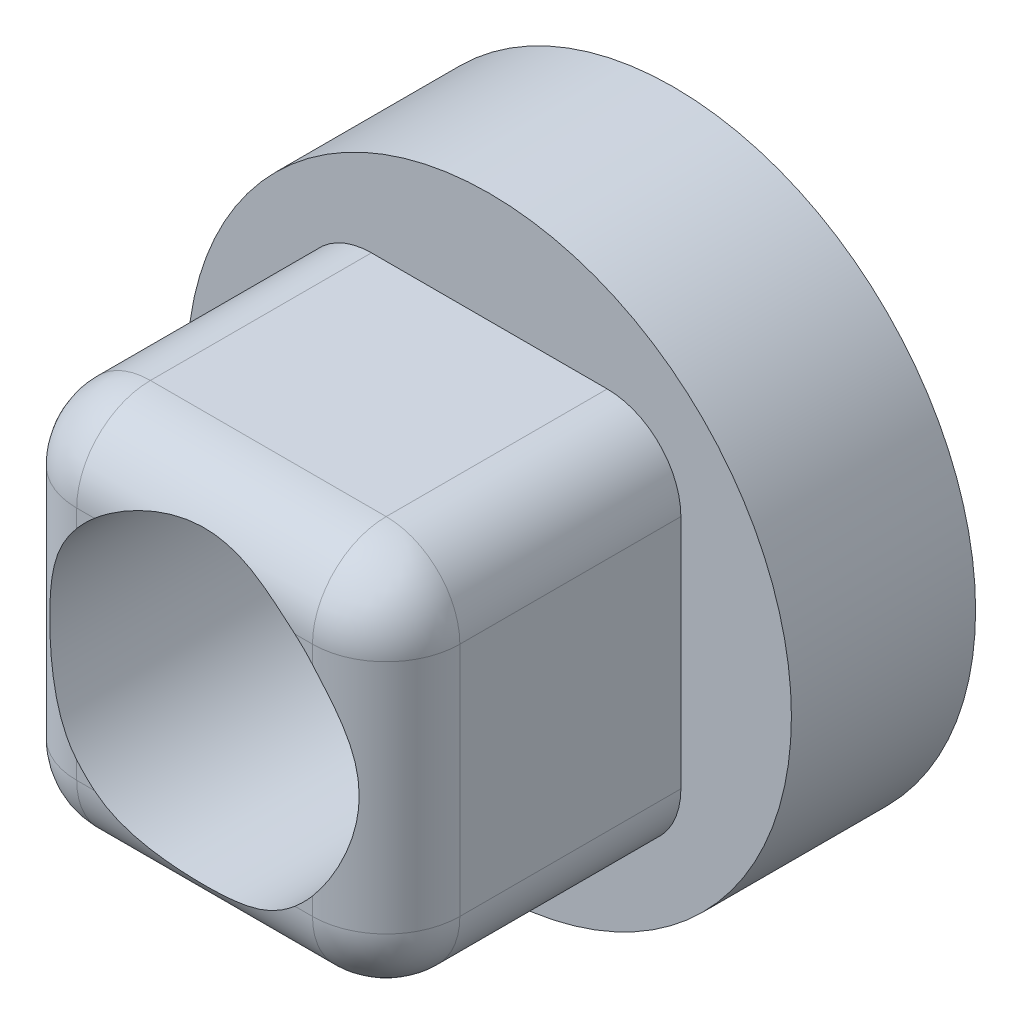
ISO-10303-21;
HEADER;
FILE_DESCRIPTION(('STEP AP214'),'2;1');
FILE_NAME('part.step','',(''),(''),'','','');
FILE_SCHEMA(('AUTOMOTIVE_DESIGN { 1 0 10303 214 1 1 1 1 }'));
ENDSEC;
DATA;
#1=APPLICATION_CONTEXT('core data for automotive mechanical design processes');
#2=APPLICATION_PROTOCOL_DEFINITION('international standard','automotive_design',2000,#1);
#3=PRODUCT_CONTEXT('',#1,'mechanical');
#4=PRODUCT('Part','Part','',(#3));
#5=PRODUCT_RELATED_PRODUCT_CATEGORY('part','',(#4));
#6=PRODUCT_DEFINITION_FORMATION('','',#4);
#7=PRODUCT_DEFINITION_CONTEXT('part definition',#1,'design');
#8=PRODUCT_DEFINITION('design','',#6,#7);
#9=PRODUCT_DEFINITION_SHAPE('','',#8);
#10=(LENGTH_UNIT() NAMED_UNIT(*) SI_UNIT(.MILLI.,.METRE.));
#11=(NAMED_UNIT(*) PLANE_ANGLE_UNIT() SI_UNIT($,.RADIAN.));
#12=(NAMED_UNIT(*) SI_UNIT($,.STERADIAN.) SOLID_ANGLE_UNIT());
#13=UNCERTAINTY_MEASURE_WITH_UNIT(LENGTH_MEASURE(1.E-05),#10,'distance_accuracy_value','');
#14=(GEOMETRIC_REPRESENTATION_CONTEXT(3) GLOBAL_UNCERTAINTY_ASSIGNED_CONTEXT((#13)) GLOBAL_UNIT_ASSIGNED_CONTEXT((#10,
#11,#12)) REPRESENTATION_CONTEXT('',''));
#15=CARTESIAN_POINT('',(0.,0.,0.));
#16=DIRECTION('',(0.,0.,1.));
#17=DIRECTION('',(1.,0.,0.));
#18=AXIS2_PLACEMENT_3D('',#15,#16,#17);
#19=CARTESIAN_POINT('',(0.,0.,6.5));
#20=DIRECTION('',(0.,0.,-1.));
#21=DIRECTION('',(-1.,0.,0.));
#22=AXIS2_PLACEMENT_3D('',#19,#20,#21);
#23=PLANE('',#22);
#24=DIRECTION('',(1.,0.,0.));
#25=VECTOR('',#24,1.);
#26=CARTESIAN_POINT('',(0.,-1.6,6.5));
#27=LINE('',#26,#25);
#28=CARTESIAN_POINT('',(1.36014705087354,-1.6,6.5));
#29=VERTEX_POINT('',#28);
#30=CARTESIAN_POINT('',(1.6,-1.6,6.5));
#31=VERTEX_POINT('',#30);
#32=EDGE_CURVE('E190',#29,#31,#27,.T.);
#33=ORIENTED_EDGE('',*,*,#32,.T.);
#34=DIRECTION('',(0.,1.,0.));
#35=VECTOR('',#34,1.);
#36=CARTESIAN_POINT('',(1.6,0.,6.5));
#37=LINE('',#36,#35);
#38=CARTESIAN_POINT('',(1.6,-1.36014705087354,6.5));
#39=VERTEX_POINT('',#38);
#40=EDGE_CURVE('E193',#31,#39,#37,.T.);
#41=ORIENTED_EDGE('',*,*,#40,.T.);
#42=CARTESIAN_POINT('',(0.,0.,6.5));
#43=DIRECTION('',(0.,0.,1.));
#44=DIRECTION('',(1.,0.,0.));
#45=AXIS2_PLACEMENT_3D('',#42,#43,#44);
#46=CIRCLE('',#45,2.1);
#47=EDGE_CURVE('E154',#29,#39,#46,.T.);
#48=ORIENTED_EDGE('',*,*,#47,.F.);
#49=EDGE_LOOP('',(#33,#41,#48));
#50=FACE_BOUND('',#49,.T.);
#51=ADVANCED_FACE('F45',(#50),#23,.F.);
#52=DIRECTION('',(0.,-1.,0.));
#53=VECTOR('',#52,1.);
#54=CARTESIAN_POINT('',(-1.6,0.,6.5));
#55=LINE('',#54,#53);
#56=CARTESIAN_POINT('',(-1.6,-1.36014705087354,6.5));
#57=VERTEX_POINT('',#56);
#58=CARTESIAN_POINT('',(-1.6,-1.6,6.5));
#59=VERTEX_POINT('',#58);
#60=EDGE_CURVE('E178',#57,#59,#55,.T.);
#61=ORIENTED_EDGE('',*,*,#60,.T.);
#62=DIRECTION('',(1.,0.,0.));
#63=VECTOR('',#62,1.);
#64=CARTESIAN_POINT('',(0.,-1.6,6.5));
#65=LINE('',#64,#63);
#66=CARTESIAN_POINT('',(-1.36014705087354,-1.6,6.5));
#67=VERTEX_POINT('',#66);
#68=EDGE_CURVE('E182',#59,#67,#65,.T.);
#69=ORIENTED_EDGE('',*,*,#68,.T.);
#70=EDGE_CURVE('E378',#57,#67,#46,.T.);
#71=ORIENTED_EDGE('',*,*,#70,.F.);
#72=EDGE_LOOP('',(#61,#69,#71));
#73=FACE_BOUND('',#72,.T.);
#74=ADVANCED_FACE('F265',(#73),#23,.F.);
#75=CARTESIAN_POINT('',(1.6,1.36014705087354,6.5));
#76=VERTEX_POINT('',#75);
#77=CARTESIAN_POINT('',(1.36014705087354,1.6,6.5));
#78=VERTEX_POINT('',#77);
#79=EDGE_CURVE('E151',#76,#78,#46,.T.);
#80=ORIENTED_EDGE('',*,*,#79,.F.);
#81=DIRECTION('',(0.,1.,0.));
#82=VECTOR('',#81,1.);
#83=CARTESIAN_POINT('',(1.6,0.,6.5));
#84=LINE('',#83,#82);
#85=CARTESIAN_POINT('',(1.6,1.6,6.5));
#86=VERTEX_POINT('',#85);
#87=EDGE_CURVE('E165',#76,#86,#84,.T.);
#88=ORIENTED_EDGE('',*,*,#87,.T.);
#89=DIRECTION('',(-1.,0.,0.));
#90=VECTOR('',#89,1.);
#91=CARTESIAN_POINT('',(0.,1.6,6.5));
#92=LINE('',#91,#90);
#93=EDGE_CURVE('E167',#86,#78,#92,.T.);
#94=ORIENTED_EDGE('',*,*,#93,.T.);
#95=EDGE_LOOP('',(#80,#88,#94));
#96=FACE_BOUND('',#95,.T.);
#97=ADVANCED_FACE('F164',(#96),#23,.F.);
#98=CARTESIAN_POINT('',(0.,0.,2.5));
#99=DIRECTION('',(0.,0.,-1.));
#100=DIRECTION('',(-1.,0.,0.));
#101=AXIS2_PLACEMENT_3D('',#98,#99,#100);
#102=CYLINDRICAL_SURFACE('',#101,4.1);
#103=CARTESIAN_POINT('',(0.,0.,2.5));
#104=DIRECTION('',(0.,0.,1.));
#105=DIRECTION('',(1.,0.,0.));
#106=AXIS2_PLACEMENT_3D('',#103,#104,#105);
#107=CIRCLE('',#106,4.1);
#108=CARTESIAN_POINT('',(4.1,0.,2.5));
#109=VERTEX_POINT('',#108);
#110=EDGE_CURVE('E398',#109,#109,#107,.T.);
#111=ORIENTED_EDGE('',*,*,#110,.F.);
#112=EDGE_LOOP('',(#111));
#113=FACE_BOUND('',#112,.T.);
#114=CARTESIAN_POINT('',(0.,0.,0.));
#115=DIRECTION('',(0.,0.,1.));
#116=DIRECTION('',(1.,0.,0.));
#117=AXIS2_PLACEMENT_3D('',#114,#115,#116);
#118=CIRCLE('',#117,4.1);
#119=CARTESIAN_POINT('',(4.1,0.,0.));
#120=VERTEX_POINT('',#119);
#121=EDGE_CURVE('E397',#120,#120,#118,.T.);
#122=ORIENTED_EDGE('',*,*,#121,.T.);
#123=EDGE_LOOP('',(#122));
#124=FACE_BOUND('',#123,.T.);
#125=ADVANCED_FACE('F281',(#113,#124),#102,.T.);
#126=CARTESIAN_POINT('',(0.,0.,2.5));
#127=DIRECTION('',(0.,0.,1.));
#128=DIRECTION('',(1.,0.,0.));
#129=AXIS2_PLACEMENT_3D('',#126,#127,#128);
#130=PLANE('',#129);
#131=DIRECTION('',(0.,1.,0.));
#132=VECTOR('',#131,1.);
#133=CARTESIAN_POINT('',(2.6,-2.6,2.5));
#134=LINE('',#133,#132);
#135=CARTESIAN_POINT('',(2.6,-1.6,2.5));
#136=VERTEX_POINT('',#135);
#137=CARTESIAN_POINT('',(2.6,1.6,2.5));
#138=VERTEX_POINT('',#137);
#139=EDGE_CURVE('E383',#136,#138,#134,.T.);
#140=ORIENTED_EDGE('',*,*,#139,.F.);
#141=CARTESIAN_POINT('',(1.6,-1.6,2.5));
#142=DIRECTION('',(0.,0.,1.));
#143=DIRECTION('',(1.,0.,0.));
#144=AXIS2_PLACEMENT_3D('',#141,#142,#143);
#145=CIRCLE('',#144,1.);
#146=CARTESIAN_POINT('',(1.6,-2.6,2.5));
#147=VERTEX_POINT('',#146);
#148=EDGE_CURVE('E55',#136,#147,#145,.F.);
#149=ORIENTED_EDGE('',*,*,#148,.T.);
#150=DIRECTION('',(1.,0.,0.));
#151=VECTOR('',#150,1.);
#152=CARTESIAN_POINT('',(-2.6,-2.6,2.5));
#153=LINE('',#152,#151);
#154=CARTESIAN_POINT('',(-1.6,-2.6,2.5));
#155=VERTEX_POINT('',#154);
#156=EDGE_CURVE('E393',#155,#147,#153,.T.);
#157=ORIENTED_EDGE('',*,*,#156,.F.);
#158=CARTESIAN_POINT('',(-1.6,-1.6,2.5));
#159=DIRECTION('',(0.,0.,1.));
#160=DIRECTION('',(1.,0.,0.));
#161=AXIS2_PLACEMENT_3D('',#158,#159,#160);
#162=CIRCLE('',#161,1.);
#163=CARTESIAN_POINT('',(-2.6,-1.6,2.5));
#164=VERTEX_POINT('',#163);
#165=EDGE_CURVE('E11',#155,#164,#162,.F.);
#166=ORIENTED_EDGE('',*,*,#165,.T.);
#167=DIRECTION('',(0.,-1.,0.));
#168=VECTOR('',#167,1.);
#169=CARTESIAN_POINT('',(-2.6,-2.6,2.5));
#170=LINE('',#169,#168);
#171=CARTESIAN_POINT('',(-2.6,1.6,2.5));
#172=VERTEX_POINT('',#171);
#173=EDGE_CURVE('E389',#172,#164,#170,.T.);
#174=ORIENTED_EDGE('',*,*,#173,.F.);
#175=CARTESIAN_POINT('',(-1.6,1.6,2.5));
#176=DIRECTION('',(0.,0.,1.));
#177=DIRECTION('',(1.,0.,0.));
#178=AXIS2_PLACEMENT_3D('',#175,#176,#177);
#179=CIRCLE('',#178,1.);
#180=CARTESIAN_POINT('',(-1.6,2.6,2.5));
#181=VERTEX_POINT('',#180);
#182=EDGE_CURVE('E325',#172,#181,#179,.F.);
#183=ORIENTED_EDGE('',*,*,#182,.T.);
#184=DIRECTION('',(-1.,0.,0.));
#185=VECTOR('',#184,1.);
#186=CARTESIAN_POINT('',(-2.6,2.6,2.5));
#187=LINE('',#186,#185);
#188=CARTESIAN_POINT('',(1.6,2.6,2.5));
#189=VERTEX_POINT('',#188);
#190=EDGE_CURVE('E386',#189,#181,#187,.T.);
#191=ORIENTED_EDGE('',*,*,#190,.F.);
#192=CARTESIAN_POINT('',(1.6,1.6,2.5));
#193=DIRECTION('',(0.,0.,1.));
#194=DIRECTION('',(1.,0.,0.));
#195=AXIS2_PLACEMENT_3D('',#192,#193,#194);
#196=CIRCLE('',#195,1.);
#197=EDGE_CURVE('E316',#189,#138,#196,.F.);
#198=ORIENTED_EDGE('',*,*,#197,.T.);
#199=EDGE_LOOP('',(#140,#149,#157,#166,#174,#183,#191,#198));
#200=FACE_BOUND('',#199,.T.);
#201=ORIENTED_EDGE('',*,*,#110,.T.);
#202=EDGE_LOOP('',(#201));
#203=FACE_BOUND('',#202,.T.);
#204=ADVANCED_FACE('F286',(#200,#203),#130,.T.);
#205=CARTESIAN_POINT('',(0.,0.,0.));
#206=DIRECTION('',(0.,0.,1.));
#207=DIRECTION('',(1.,0.,0.));
#208=AXIS2_PLACEMENT_3D('',#205,#206,#207);
#209=PLANE('',#208);
#210=CARTESIAN_POINT('',(0.,0.,0.));
#211=DIRECTION('',(0.,0.,1.));
#212=DIRECTION('',(1.,0.,0.));
#213=AXIS2_PLACEMENT_3D('',#210,#211,#212);
#214=CIRCLE('',#213,2.1);
#215=CARTESIAN_POINT('',(2.1,0.,0.));
#216=VERTEX_POINT('',#215);
#217=EDGE_CURVE('E169',#216,#216,#214,.T.);
#218=ORIENTED_EDGE('',*,*,#217,.T.);
#219=EDGE_LOOP('',(#218));
#220=FACE_BOUND('',#219,.T.);
#221=ORIENTED_EDGE('',*,*,#121,.F.);
#222=EDGE_LOOP('',(#221));
#223=FACE_BOUND('',#222,.T.);
#224=ADVANCED_FACE('F291',(#220,#223),#209,.F.);
#225=CARTESIAN_POINT('',(2.6,-2.6,6.5));
#226=DIRECTION('',(-1.,0.,0.));
#227=DIRECTION('',(0.,0.,1.));
#228=AXIS2_PLACEMENT_3D('',#225,#226,#227);
#229=PLANE('',#228);
#230=ORIENTED_EDGE('',*,*,#139,.T.);
#231=DIRECTION('',(0.,0.,-1.));
#232=VECTOR('',#231,1.);
#233=CARTESIAN_POINT('',(2.6,1.6,6.5));
#234=LINE('',#233,#232);
#235=CARTESIAN_POINT('',(2.6,1.6,5.5));
#236=VERTEX_POINT('',#235);
#237=EDGE_CURVE('E320',#138,#236,#234,.F.);
#238=ORIENTED_EDGE('',*,*,#237,.T.);
#239=DIRECTION('',(0.,1.,0.));
#240=VECTOR('',#239,1.);
#241=CARTESIAN_POINT('',(2.6,-2.6,5.5));
#242=LINE('',#241,#240);
#243=CARTESIAN_POINT('',(2.6,-1.6,5.5));
#244=VERTEX_POINT('',#243);
#245=EDGE_CURVE('E419',#236,#244,#242,.F.);
#246=ORIENTED_EDGE('',*,*,#245,.T.);
#247=DIRECTION('',(0.,0.,-1.));
#248=VECTOR('',#247,1.);
#249=CARTESIAN_POINT('',(2.6,-1.6,6.5));
#250=LINE('',#249,#248);
#251=EDGE_CURVE('E160',#244,#136,#250,.T.);
#252=ORIENTED_EDGE('',*,*,#251,.T.);
#253=EDGE_LOOP('',(#230,#238,#246,#252));
#254=FACE_BOUND('',#253,.T.);
#255=ADVANCED_FACE('F455',(#254),#229,.F.);
#256=CARTESIAN_POINT('',(-2.6,2.6,6.5));
#257=DIRECTION('',(0.,-1.,0.));
#258=DIRECTION('',(0.,0.,-1.));
#259=AXIS2_PLACEMENT_3D('',#256,#257,#258);
#260=PLANE('',#259);
#261=ORIENTED_EDGE('',*,*,#190,.T.);
#262=DIRECTION('',(0.,0.,-1.));
#263=VECTOR('',#262,1.);
#264=CARTESIAN_POINT('',(-1.6,2.6,6.5));
#265=LINE('',#264,#263);
#266=CARTESIAN_POINT('',(-1.6,2.6,5.5));
#267=VERTEX_POINT('',#266);
#268=EDGE_CURVE('E63',#181,#267,#265,.F.);
#269=ORIENTED_EDGE('',*,*,#268,.T.);
#270=DIRECTION('',(-1.,0.,0.));
#271=VECTOR('',#270,1.);
#272=CARTESIAN_POINT('',(-2.6,2.6,5.5));
#273=LINE('',#272,#271);
#274=CARTESIAN_POINT('',(1.6,2.6,5.5));
#275=VERTEX_POINT('',#274);
#276=EDGE_CURVE('E68',#267,#275,#273,.F.);
#277=ORIENTED_EDGE('',*,*,#276,.T.);
#278=DIRECTION('',(0.,0.,-1.));
#279=VECTOR('',#278,1.);
#280=CARTESIAN_POINT('',(1.6,2.6,6.5));
#281=LINE('',#280,#279);
#282=EDGE_CURVE('E318',#275,#189,#281,.T.);
#283=ORIENTED_EDGE('',*,*,#282,.T.);
#284=EDGE_LOOP('',(#261,#269,#277,#283));
#285=FACE_BOUND('',#284,.T.);
#286=ADVANCED_FACE('F447',(#285),#260,.F.);
#287=CARTESIAN_POINT('',(-2.6,-2.6,6.5));
#288=DIRECTION('',(1.,0.,0.));
#289=DIRECTION('',(0.,0.,-1.));
#290=AXIS2_PLACEMENT_3D('',#287,#288,#289);
#291=PLANE('',#290);
#292=DIRECTION('',(0.,-1.,0.));
#293=VECTOR('',#292,1.);
#294=CARTESIAN_POINT('',(-2.6,-2.6,5.5));
#295=LINE('',#294,#293);
#296=CARTESIAN_POINT('',(-2.6,-1.6,5.5));
#297=VERTEX_POINT('',#296);
#298=CARTESIAN_POINT('',(-2.6,1.6,5.5));
#299=VERTEX_POINT('',#298);
#300=EDGE_CURVE('E436',#297,#299,#295,.F.);
#301=ORIENTED_EDGE('',*,*,#300,.T.);
#302=DIRECTION('',(0.,0.,-1.));
#303=VECTOR('',#302,1.);
#304=CARTESIAN_POINT('',(-2.6,1.6,6.5));
#305=LINE('',#304,#303);
#306=EDGE_CURVE('E439',#299,#172,#305,.T.);
#307=ORIENTED_EDGE('',*,*,#306,.T.);
#308=ORIENTED_EDGE('',*,*,#173,.T.);
#309=DIRECTION('',(0.,0.,-1.));
#310=VECTOR('',#309,1.);
#311=CARTESIAN_POINT('',(-2.6,-1.6,6.5));
#312=LINE('',#311,#310);
#313=EDGE_CURVE('E433',#164,#297,#312,.F.);
#314=ORIENTED_EDGE('',*,*,#313,.T.);
#315=EDGE_LOOP('',(#301,#307,#308,#314));
#316=FACE_BOUND('',#315,.T.);
#317=ADVANCED_FACE('F278',(#316),#291,.F.);
#318=CARTESIAN_POINT('',(-2.6,-2.6,6.5));
#319=DIRECTION('',(0.,1.,0.));
#320=DIRECTION('',(0.,0.,1.));
#321=AXIS2_PLACEMENT_3D('',#318,#319,#320);
#322=PLANE('',#321);
#323=ORIENTED_EDGE('',*,*,#156,.T.);
#324=DIRECTION('',(0.,0.,-1.));
#325=VECTOR('',#324,1.);
#326=CARTESIAN_POINT('',(1.6,-2.6,6.5));
#327=LINE('',#326,#325);
#328=CARTESIAN_POINT('',(1.6,-2.6,5.5));
#329=VERTEX_POINT('',#328);
#330=EDGE_CURVE('E430',#147,#329,#327,.F.);
#331=ORIENTED_EDGE('',*,*,#330,.T.);
#332=DIRECTION('',(1.,0.,0.));
#333=VECTOR('',#332,1.);
#334=CARTESIAN_POINT('',(-2.6,-2.6,5.5));
#335=LINE('',#334,#333);
#336=CARTESIAN_POINT('',(-1.6,-2.6,5.5));
#337=VERTEX_POINT('',#336);
#338=EDGE_CURVE('E427',#329,#337,#335,.F.);
#339=ORIENTED_EDGE('',*,*,#338,.T.);
#340=DIRECTION('',(0.,0.,-1.));
#341=VECTOR('',#340,1.);
#342=CARTESIAN_POINT('',(-1.6,-2.6,6.5));
#343=LINE('',#342,#341);
#344=EDGE_CURVE('E424',#337,#155,#343,.T.);
#345=ORIENTED_EDGE('',*,*,#344,.T.);
#346=EDGE_LOOP('',(#323,#331,#339,#345));
#347=FACE_BOUND('',#346,.T.);
#348=ADVANCED_FACE('F273',(#347),#322,.F.);
#349=DIRECTION('',(-1.,0.,0.));
#350=VECTOR('',#349,1.);
#351=CARTESIAN_POINT('',(0.,1.6,6.5));
#352=LINE('',#351,#350);
#353=CARTESIAN_POINT('',(-1.36014705087354,1.6,6.5));
#354=VERTEX_POINT('',#353);
#355=CARTESIAN_POINT('',(-1.6,1.6,6.5));
#356=VERTEX_POINT('',#355);
#357=EDGE_CURVE('E402',#354,#356,#352,.T.);
#358=ORIENTED_EDGE('',*,*,#357,.T.);
#359=DIRECTION('',(0.,-1.,0.));
#360=VECTOR('',#359,1.);
#361=CARTESIAN_POINT('',(-1.6,0.,6.5));
#362=LINE('',#361,#360);
#363=CARTESIAN_POINT('',(-1.6,1.36014705087354,6.5));
#364=VERTEX_POINT('',#363);
#365=EDGE_CURVE('E184',#356,#364,#362,.T.);
#366=ORIENTED_EDGE('',*,*,#365,.T.);
#367=EDGE_CURVE('E170',#354,#364,#46,.T.);
#368=ORIENTED_EDGE('',*,*,#367,.F.);
#369=EDGE_LOOP('',(#358,#366,#368));
#370=FACE_BOUND('',#369,.T.);
#371=ADVANCED_FACE('F218',(#370),#23,.F.);
#372=CARTESIAN_POINT('',(0.,0.,0.));
#373=DIRECTION('',(0.,0.,1.));
#374=DIRECTION('',(1.,0.,0.));
#375=AXIS2_PLACEMENT_3D('',#372,#373,#374);
#376=CYLINDRICAL_SURFACE('',#375,2.1);
#377=ORIENTED_EDGE('',*,*,#217,.F.);
#378=EDGE_LOOP('',(#377));
#379=FACE_BOUND('',#378,.T.);
#380=ORIENTED_EDGE('',*,*,#47,.T.);
#381=CARTESIAN_POINT('',(1.6,-1.36014705087354,6.5));
#382=CARTESIAN_POINT('',(1.63382133819093,-1.32036910283127,6.49998887521405));
#383=CARTESIAN_POINT('',(1.66611035661751,-1.27937265674942,6.49828617201001));
#384=CARTESIAN_POINT('',(1.72743214761309,-1.19527262996065,6.49232712251131));
#385=CARTESIAN_POINT('',(1.75646963365867,-1.15217223291287,6.48807453097408));
#386=CARTESIAN_POINT('',(1.83857961195255,-1.01999692631513,6.47271969201774));
#387=CARTESIAN_POINT('',(1.88662600355463,-0.928075819109664,6.45902153041327));
#388=CARTESIAN_POINT('',(1.96969741646632,-0.735888351757162,6.43022201555198));
#389=CARTESIAN_POINT('',(2.0043566556405,-0.635468372257919,6.41509367492638));
#390=CARTESIAN_POINT('',(2.04474216543318,-0.481500141051213,6.39578013029831));
#391=CARTESIAN_POINT('',(2.05626811227114,-0.429639679632808,6.38990690239075));
#392=CARTESIAN_POINT('',(2.07537255754745,-0.325042622410467,6.37985174312905));
#393=CARTESIAN_POINT('',(2.08295261935486,-0.272306382151055,6.37566914209157));
#394=CARTESIAN_POINT('',(2.0945489250387,-0.161859982072425,6.36917789474697));
#395=CARTESIAN_POINT('',(2.09821557012956,-0.104101532803561,6.36705444366723));
#396=CARTESIAN_POINT('',(2.1007647588152,0.0115585852095186,6.36558467338251));
#397=CARTESIAN_POINT('',(2.09964713691125,0.0694602588389469,6.3662384502482));
#398=CARTESIAN_POINT('',(2.09263925139041,0.184970176018158,6.37024297017195));
#399=CARTESIAN_POINT('',(2.08674146338072,0.242577812759855,6.37359796512455));
#400=CARTESIAN_POINT('',(2.07025277052223,0.356921094187567,6.38258028275683));
#401=CARTESIAN_POINT('',(2.05966177107793,0.41365672127367,6.38820765123784));
#402=CARTESIAN_POINT('',(2.02346525205984,0.571352820751212,6.40629276075553));
#403=CARTESIAN_POINT('',(1.99264554802486,0.670937439412876,6.42059224535536));
#404=CARTESIAN_POINT('',(1.91673378314013,0.864234619217806,6.449375938456));
#405=CARTESIAN_POINT('',(1.8716697969491,0.957958300342494,6.46385973025876));
#406=CARTESIAN_POINT('',(1.78809652199128,1.10305306207398,6.48268711372842));
#407=CARTESIAN_POINT('',(1.75388886378786,1.15668227261743,6.488782247548));
#408=CARTESIAN_POINT('',(1.68056487342743,1.26086350057486,6.49742806826973));
#409=CARTESIAN_POINT('',(1.64144224045739,1.31141144212048,6.49997415382237));
#410=CARTESIAN_POINT('',(1.6,1.36014705087354,6.5));
#411=B_SPLINE_CURVE_WITH_KNOTS('',3,(#381,#382,#383,#384,#385,#386,#387,#388,#389,#390,#391,
#392,#393,#394,#395,#396,#397,#398,#399,#400,#401,#402,#403,#404,#405,#406,#407,#408,#409,#410),
.UNSPECIFIED.,.F.,.F.,(4,2,2,2,2,2,2,2,2,2,2,2,2,2,4),(0.,0.156475281406295,0.312720713995635,
0.625319935939601,0.945940823677501,1.1061396175846,1.26627489194649,1.4397539312071,
1.61323897155323,1.78699762386381,1.96075977858051,2.27517350552064,2.58897136509695,
2.78034713276844,2.9719707895253),.UNSPECIFIED.);
#412=EDGE_CURVE('E148',#39,#76,#411,.T.);
#413=ORIENTED_EDGE('',*,*,#412,.T.);
#414=ORIENTED_EDGE('',*,*,#79,.T.);
#415=CARTESIAN_POINT('',(1.36014705087354,1.6,6.5));
#416=CARTESIAN_POINT('',(1.32036910283127,1.63382133819093,6.49998887521405));
#417=CARTESIAN_POINT('',(1.27937265674942,1.66611035661751,6.49828617201001));
#418=CARTESIAN_POINT('',(1.19527262996065,1.72743214761309,6.49232712251131));
#419=CARTESIAN_POINT('',(1.15217223291287,1.75646963365867,6.48807453097408));
#420=CARTESIAN_POINT('',(1.01999692631513,1.83857961195255,6.47271969201774));
#421=CARTESIAN_POINT('',(0.928075819109664,1.88662600355463,6.45902153041327));
#422=CARTESIAN_POINT('',(0.735888351757162,1.96969741646632,6.43022201555198));
#423=CARTESIAN_POINT('',(0.635468372257919,2.0043566556405,6.41509367492638));
#424=CARTESIAN_POINT('',(0.481500141051213,2.04474216543318,6.39578013029831));
#425=CARTESIAN_POINT('',(0.429639679632808,2.05626811227114,6.38990690239075));
#426=CARTESIAN_POINT('',(0.325042622410467,2.07537255754745,6.37985174312905));
#427=CARTESIAN_POINT('',(0.272306382151055,2.08295261935486,6.37566914209157));
#428=CARTESIAN_POINT('',(0.161859982072425,2.0945489250387,6.36917789474697));
#429=CARTESIAN_POINT('',(0.104101532803561,2.09821557012956,6.36705444366723));
#430=CARTESIAN_POINT('',(-0.0115585852095186,2.1007647588152,6.36558467338251));
#431=CARTESIAN_POINT('',(-0.0694602588389469,2.09964713691125,6.3662384502482));
#432=CARTESIAN_POINT('',(-0.184970176018158,2.09263925139041,6.37024297017195));
#433=CARTESIAN_POINT('',(-0.242577812759855,2.08674146338072,6.37359796512455));
#434=CARTESIAN_POINT('',(-0.356921094187567,2.07025277052223,6.38258028275683));
#435=CARTESIAN_POINT('',(-0.41365672127367,2.05966177107793,6.38820765123784));
#436=CARTESIAN_POINT('',(-0.571352820751212,2.02346525205984,6.40629276075553));
#437=CARTESIAN_POINT('',(-0.670937439412876,1.99264554802486,6.42059224535536));
#438=CARTESIAN_POINT('',(-0.864234619217806,1.91673378314013,6.449375938456));
#439=CARTESIAN_POINT('',(-0.957958300342494,1.8716697969491,6.46385973025876));
#440=CARTESIAN_POINT('',(-1.10305306207398,1.78809652199128,6.48268711372842));
#441=CARTESIAN_POINT('',(-1.15668227261743,1.75388886378786,6.488782247548));
#442=CARTESIAN_POINT('',(-1.26086350057486,1.68056487342743,6.49742806826973));
#443=CARTESIAN_POINT('',(-1.31141144212048,1.64144224045739,6.49997415382237));
#444=CARTESIAN_POINT('',(-1.36014705087354,1.6,6.5));
#445=B_SPLINE_CURVE_WITH_KNOTS('',3,(#415,#416,#417,#418,#419,#420,#421,#422,#423,#424,#425,
#426,#427,#428,#429,#430,#431,#432,#433,#434,#435,#436,#437,#438,#439,#440,#441,#442,#443,#444),
.UNSPECIFIED.,.F.,.F.,(4,2,2,2,2,2,2,2,2,2,2,2,2,2,4),(0.,0.156475281406295,0.312720713995635,
0.625319935939601,0.945940823677501,1.1061396175846,1.26627489194649,1.4397539312071,
1.61323897155323,1.78699762386381,1.96075977858051,2.27517350552064,2.58897136509695,
2.78034713276844,2.9719707895253),.UNSPECIFIED.);
#446=EDGE_CURVE('E196',#78,#354,#445,.T.);
#447=ORIENTED_EDGE('',*,*,#446,.T.);
#448=ORIENTED_EDGE('',*,*,#367,.T.);
#449=CARTESIAN_POINT('',(-1.6,1.36014705087354,6.5));
#450=CARTESIAN_POINT('',(-1.63382133819093,1.32036910283127,6.49998887521405));
#451=CARTESIAN_POINT('',(-1.66611035661751,1.27937265674942,6.49828617201001));
#452=CARTESIAN_POINT('',(-1.72743214761309,1.19527262996065,6.49232712251131));
#453=CARTESIAN_POINT('',(-1.75646963365867,1.15217223291287,6.48807453097408));
#454=CARTESIAN_POINT('',(-1.83857961195255,1.01999692631513,6.47271969201774));
#455=CARTESIAN_POINT('',(-1.88662600355463,0.928075819109664,6.45902153041327));
#456=CARTESIAN_POINT('',(-1.96969741646632,0.735888351757162,6.43022201555198));
#457=CARTESIAN_POINT('',(-2.0043566556405,0.635468372257919,6.41509367492638));
#458=CARTESIAN_POINT('',(-2.04474216543318,0.481500141051213,6.39578013029831));
#459=CARTESIAN_POINT('',(-2.05626811227114,0.429639679632808,6.38990690239075));
#460=CARTESIAN_POINT('',(-2.07537255754745,0.325042622410467,6.37985174312905));
#461=CARTESIAN_POINT('',(-2.08295261935486,0.272306382151055,6.37566914209157));
#462=CARTESIAN_POINT('',(-2.0945489250387,0.161859982072425,6.36917789474697));
#463=CARTESIAN_POINT('',(-2.09821557012956,0.104101532803561,6.36705444366723));
#464=CARTESIAN_POINT('',(-2.1007647588152,-0.0115585852095186,6.36558467338251));
#465=CARTESIAN_POINT('',(-2.09964713691125,-0.0694602588389469,6.3662384502482));
#466=CARTESIAN_POINT('',(-2.09263925139041,-0.184970176018158,6.37024297017195));
#467=CARTESIAN_POINT('',(-2.08674146338072,-0.242577812759855,6.37359796512455));
#468=CARTESIAN_POINT('',(-2.07025277052223,-0.356921094187567,6.38258028275683));
#469=CARTESIAN_POINT('',(-2.05966177107793,-0.41365672127367,6.38820765123784));
#470=CARTESIAN_POINT('',(-2.02346525205984,-0.571352820751212,6.40629276075553));
#471=CARTESIAN_POINT('',(-1.99264554802486,-0.670937439412876,6.42059224535536));
#472=CARTESIAN_POINT('',(-1.91673378314013,-0.864234619217806,6.449375938456));
#473=CARTESIAN_POINT('',(-1.8716697969491,-0.957958300342494,6.46385973025876));
#474=CARTESIAN_POINT('',(-1.78809652199128,-1.10305306207398,6.48268711372842));
#475=CARTESIAN_POINT('',(-1.75388886378786,-1.15668227261743,6.488782247548));
#476=CARTESIAN_POINT('',(-1.68056487342743,-1.26086350057486,6.49742806826973));
#477=CARTESIAN_POINT('',(-1.64144224045739,-1.31141144212048,6.49997415382237));
#478=CARTESIAN_POINT('',(-1.6,-1.36014705087354,6.5));
#479=B_SPLINE_CURVE_WITH_KNOTS('',3,(#449,#450,#451,#452,#453,#454,#455,#456,#457,#458,#459,
#460,#461,#462,#463,#464,#465,#466,#467,#468,#469,#470,#471,#472,#473,#474,#475,#476,#477,#478),
.UNSPECIFIED.,.F.,.F.,(4,2,2,2,2,2,2,2,2,2,2,2,2,2,4),(0.,0.156475281406295,0.312720713995635,
0.625319935939601,0.945940823677501,1.1061396175846,1.26627489194649,1.4397539312071,
1.61323897155323,1.78699762386381,1.96075977858051,2.27517350552064,2.58897136509695,
2.78034713276844,2.9719707895253),.UNSPECIFIED.);
#480=EDGE_CURVE('E205',#364,#57,#479,.T.);
#481=ORIENTED_EDGE('',*,*,#480,.T.);
#482=ORIENTED_EDGE('',*,*,#70,.T.);
#483=CARTESIAN_POINT('',(-1.36014705087354,-1.6,6.5));
#484=CARTESIAN_POINT('',(-1.32036910283127,-1.63382133819093,6.49998887521405));
#485=CARTESIAN_POINT('',(-1.27937265674942,-1.66611035661751,6.49828617201001));
#486=CARTESIAN_POINT('',(-1.19527262996065,-1.72743214761309,6.49232712251131));
#487=CARTESIAN_POINT('',(-1.15217223291287,-1.75646963365867,6.48807453097408));
#488=CARTESIAN_POINT('',(-1.01999692631513,-1.83857961195255,6.47271969201774));
#489=CARTESIAN_POINT('',(-0.928075819109664,-1.88662600355463,6.45902153041327));
#490=CARTESIAN_POINT('',(-0.735888351757162,-1.96969741646632,6.43022201555198));
#491=CARTESIAN_POINT('',(-0.635468372257919,-2.0043566556405,6.41509367492638));
#492=CARTESIAN_POINT('',(-0.481500141051213,-2.04474216543318,6.39578013029831));
#493=CARTESIAN_POINT('',(-0.429639679632808,-2.05626811227114,6.38990690239075));
#494=CARTESIAN_POINT('',(-0.325042622410467,-2.07537255754745,6.37985174312905));
#495=CARTESIAN_POINT('',(-0.272306382151055,-2.08295261935486,6.37566914209157));
#496=CARTESIAN_POINT('',(-0.161859982072425,-2.0945489250387,6.36917789474697));
#497=CARTESIAN_POINT('',(-0.104101532803561,-2.09821557012956,6.36705444366723));
#498=CARTESIAN_POINT('',(0.0115585852095186,-2.1007647588152,6.36558467338251));
#499=CARTESIAN_POINT('',(0.0694602588389469,-2.09964713691125,6.3662384502482));
#500=CARTESIAN_POINT('',(0.184970176018158,-2.09263925139041,6.37024297017195));
#501=CARTESIAN_POINT('',(0.242577812759855,-2.08674146338072,6.37359796512455));
#502=CARTESIAN_POINT('',(0.356921094187567,-2.07025277052223,6.38258028275683));
#503=CARTESIAN_POINT('',(0.41365672127367,-2.05966177107793,6.38820765123784));
#504=CARTESIAN_POINT('',(0.571352820751212,-2.02346525205984,6.40629276075553));
#505=CARTESIAN_POINT('',(0.670937439412876,-1.99264554802486,6.42059224535536));
#506=CARTESIAN_POINT('',(0.864234619217806,-1.91673378314013,6.449375938456));
#507=CARTESIAN_POINT('',(0.957958300342494,-1.8716697969491,6.46385973025876));
#508=CARTESIAN_POINT('',(1.10305306207398,-1.78809652199128,6.48268711372842));
#509=CARTESIAN_POINT('',(1.15668227261743,-1.75388886378786,6.488782247548));
#510=CARTESIAN_POINT('',(1.26086350057486,-1.68056487342743,6.49742806826973));
#511=CARTESIAN_POINT('',(1.31141144212048,-1.64144224045739,6.49997415382237));
#512=CARTESIAN_POINT('',(1.36014705087354,-1.6,6.5));
#513=B_SPLINE_CURVE_WITH_KNOTS('',3,(#483,#484,#485,#486,#487,#488,#489,#490,#491,#492,#493,
#494,#495,#496,#497,#498,#499,#500,#501,#502,#503,#504,#505,#506,#507,#508,#509,#510,#511,#512),
.UNSPECIFIED.,.F.,.F.,(4,2,2,2,2,2,2,2,2,2,2,2,2,2,4),(0.,0.156475281406295,0.312720713995635,
0.625319935939601,0.945940823677501,1.1061396175846,1.26627489194649,1.4397539312071,
1.61323897155323,1.78699762386381,1.96075977858051,2.27517350552064,2.58897136509695,
2.78034713276844,2.9719707895253),.UNSPECIFIED.);
#514=EDGE_CURVE('E161',#67,#29,#513,.T.);
#515=ORIENTED_EDGE('',*,*,#514,.T.);
#516=EDGE_LOOP('',(#380,#413,#414,#447,#448,#481,#482,#515));
#517=FACE_BOUND('',#516,.T.);
#518=ADVANCED_FACE('F150',(#379,#517),#376,.F.);
#519=CARTESIAN_POINT('',(-1.6,-1.6,6.5));
#520=DIRECTION('',(0.,0.,-1.));
#521=DIRECTION('',(-1.,0.,0.));
#522=AXIS2_PLACEMENT_3D('',#519,#520,#521);
#523=CYLINDRICAL_SURFACE('',#522,1.);
#524=ORIENTED_EDGE('',*,*,#165,.F.);
#525=ORIENTED_EDGE('',*,*,#344,.F.);
#526=CARTESIAN_POINT('',(-1.6,-1.6,5.5));
#527=DIRECTION('',(0.,0.,1.));
#528=DIRECTION('',(1.,0.,0.));
#529=AXIS2_PLACEMENT_3D('',#526,#527,#528);
#530=CIRCLE('',#529,1.);
#531=EDGE_CURVE('E49',#297,#337,#530,.T.);
#532=ORIENTED_EDGE('',*,*,#531,.F.);
#533=ORIENTED_EDGE('',*,*,#313,.F.);
#534=EDGE_LOOP('',(#524,#525,#532,#533));
#535=FACE_BOUND('',#534,.T.);
#536=ADVANCED_FACE('F47',(#535),#523,.T.);
#537=CARTESIAN_POINT('',(-1.6,0.,5.5));
#538=DIRECTION('',(0.,-1.,0.));
#539=DIRECTION('',(0.,0.,-1.));
#540=AXIS2_PLACEMENT_3D('',#537,#538,#539);
#541=CYLINDRICAL_SURFACE('',#540,1.);
#542=CARTESIAN_POINT('',(-1.6,1.6,5.5));
#543=DIRECTION('',(0.,1.,0.));
#544=DIRECTION('',(0.,0.,1.));
#545=AXIS2_PLACEMENT_3D('',#542,#543,#544);
#546=CIRCLE('',#545,1.);
#547=EDGE_CURVE('E366',#299,#356,#546,.T.);
#548=ORIENTED_EDGE('',*,*,#547,.F.);
#549=ORIENTED_EDGE('',*,*,#300,.F.);
#550=CARTESIAN_POINT('',(-1.6,-1.6,5.5));
#551=DIRECTION('',(0.,-1.,0.));
#552=DIRECTION('',(0.,0.,-1.));
#553=AXIS2_PLACEMENT_3D('',#550,#551,#552);
#554=CIRCLE('',#553,1.);
#555=EDGE_CURVE('E369',#59,#297,#554,.T.);
#556=ORIENTED_EDGE('',*,*,#555,.F.);
#557=ORIENTED_EDGE('',*,*,#60,.F.);
#558=ORIENTED_EDGE('',*,*,#480,.F.);
#559=ORIENTED_EDGE('',*,*,#365,.F.);
#560=EDGE_LOOP('',(#548,#549,#556,#557,#558,#559));
#561=FACE_BOUND('',#560,.T.);
#562=ADVANCED_FACE('F254',(#561),#541,.T.);
#563=CARTESIAN_POINT('',(-1.6,1.6,6.5));
#564=DIRECTION('',(0.,0.,-1.));
#565=DIRECTION('',(-1.,0.,0.));
#566=AXIS2_PLACEMENT_3D('',#563,#564,#565);
#567=CYLINDRICAL_SURFACE('',#566,1.);
#568=ORIENTED_EDGE('',*,*,#182,.F.);
#569=ORIENTED_EDGE('',*,*,#306,.F.);
#570=CARTESIAN_POINT('',(-1.6,1.6,5.5));
#571=DIRECTION('',(0.,0.,1.));
#572=DIRECTION('',(1.,0.,0.));
#573=AXIS2_PLACEMENT_3D('',#570,#571,#572);
#574=CIRCLE('',#573,1.);
#575=EDGE_CURVE('E362',#267,#299,#574,.T.);
#576=ORIENTED_EDGE('',*,*,#575,.F.);
#577=ORIENTED_EDGE('',*,*,#268,.F.);
#578=EDGE_LOOP('',(#568,#569,#576,#577));
#579=FACE_BOUND('',#578,.T.);
#580=ADVANCED_FACE('F251',(#579),#567,.T.);
#581=CARTESIAN_POINT('',(-1.6,-1.6,5.5));
#582=DIRECTION('',(-1.,0.,0.));
#583=DIRECTION('',(0.,0.,1.));
#584=AXIS2_PLACEMENT_3D('',#581,#582,#583);
#585=SPHERICAL_SURFACE('',#584,1.);
#586=ORIENTED_EDGE('',*,*,#555,.T.);
#587=ORIENTED_EDGE('',*,*,#531,.T.);
#588=CARTESIAN_POINT('',(-1.6,-1.6,5.5));
#589=DIRECTION('',(-1.,0.,0.));
#590=DIRECTION('',(0.,0.,1.));
#591=AXIS2_PLACEMENT_3D('',#588,#589,#590);
#592=CIRCLE('',#591,1.);
#593=EDGE_CURVE('E358',#59,#337,#592,.F.);
#594=ORIENTED_EDGE('',*,*,#593,.F.);
#595=EDGE_LOOP('',(#586,#587,#594));
#596=FACE_BOUND('',#595,.T.);
#597=ADVANCED_FACE('F247',(#596),#585,.T.);
#598=CARTESIAN_POINT('',(-1.6,1.6,5.5));
#599=DIRECTION('',(-1.,0.,0.));
#600=DIRECTION('',(0.,0.,1.));
#601=AXIS2_PLACEMENT_3D('',#598,#599,#600);
#602=SPHERICAL_SURFACE('',#601,1.);
#603=ORIENTED_EDGE('',*,*,#575,.T.);
#604=ORIENTED_EDGE('',*,*,#547,.T.);
#605=CARTESIAN_POINT('',(-1.6,1.6,5.5));
#606=DIRECTION('',(-1.,0.,0.));
#607=DIRECTION('',(0.,0.,1.));
#608=AXIS2_PLACEMENT_3D('',#605,#606,#607);
#609=CIRCLE('',#608,1.);
#610=EDGE_CURVE('E354',#267,#356,#609,.F.);
#611=ORIENTED_EDGE('',*,*,#610,.F.);
#612=EDGE_LOOP('',(#603,#604,#611));
#613=FACE_BOUND('',#612,.T.);
#614=ADVANCED_FACE('F243',(#613),#602,.T.);
#615=CARTESIAN_POINT('',(1.6,-1.6,6.5));
#616=DIRECTION('',(0.,0.,-1.));
#617=DIRECTION('',(-1.,0.,0.));
#618=AXIS2_PLACEMENT_3D('',#615,#616,#617);
#619=CYLINDRICAL_SURFACE('',#618,1.);
#620=ORIENTED_EDGE('',*,*,#148,.F.);
#621=ORIENTED_EDGE('',*,*,#251,.F.);
#622=CARTESIAN_POINT('',(1.6,-1.6,5.5));
#623=DIRECTION('',(0.,0.,1.));
#624=DIRECTION('',(1.,0.,0.));
#625=AXIS2_PLACEMENT_3D('',#622,#623,#624);
#626=CIRCLE('',#625,1.);
#627=EDGE_CURVE('E350',#329,#244,#626,.T.);
#628=ORIENTED_EDGE('',*,*,#627,.F.);
#629=ORIENTED_EDGE('',*,*,#330,.F.);
#630=EDGE_LOOP('',(#620,#621,#628,#629));
#631=FACE_BOUND('',#630,.T.);
#632=ADVANCED_FACE('F239',(#631),#619,.T.);
#633=CARTESIAN_POINT('',(0.,-1.6,5.5));
#634=DIRECTION('',(1.,0.,0.));
#635=DIRECTION('',(0.,0.,-1.));
#636=AXIS2_PLACEMENT_3D('',#633,#634,#635);
#637=CYLINDRICAL_SURFACE('',#636,1.);
#638=ORIENTED_EDGE('',*,*,#593,.T.);
#639=ORIENTED_EDGE('',*,*,#338,.F.);
#640=CARTESIAN_POINT('',(1.6,-1.6,5.5));
#641=DIRECTION('',(1.,0.,0.));
#642=DIRECTION('',(0.,0.,-1.));
#643=AXIS2_PLACEMENT_3D('',#640,#641,#642);
#644=CIRCLE('',#643,1.);
#645=EDGE_CURVE('E346',#31,#329,#644,.T.);
#646=ORIENTED_EDGE('',*,*,#645,.F.);
#647=ORIENTED_EDGE('',*,*,#32,.F.);
#648=ORIENTED_EDGE('',*,*,#514,.F.);
#649=ORIENTED_EDGE('',*,*,#68,.F.);
#650=EDGE_LOOP('',(#638,#639,#646,#647,#648,#649));
#651=FACE_BOUND('',#650,.T.);
#652=ADVANCED_FACE('F235',(#651),#637,.T.);
#653=CARTESIAN_POINT('',(0.,1.6,5.5));
#654=DIRECTION('',(-1.,0.,0.));
#655=DIRECTION('',(0.,0.,1.));
#656=AXIS2_PLACEMENT_3D('',#653,#654,#655);
#657=CYLINDRICAL_SURFACE('',#656,1.);
#658=ORIENTED_EDGE('',*,*,#446,.F.);
#659=ORIENTED_EDGE('',*,*,#93,.F.);
#660=CARTESIAN_POINT('',(1.6,1.6,5.5));
#661=DIRECTION('',(1.,0.,0.));
#662=DIRECTION('',(0.,0.,-1.));
#663=AXIS2_PLACEMENT_3D('',#660,#661,#662);
#664=CIRCLE('',#663,1.);
#665=EDGE_CURVE('E342',#275,#86,#664,.T.);
#666=ORIENTED_EDGE('',*,*,#665,.F.);
#667=ORIENTED_EDGE('',*,*,#276,.F.);
#668=ORIENTED_EDGE('',*,*,#610,.T.);
#669=ORIENTED_EDGE('',*,*,#357,.F.);
#670=EDGE_LOOP('',(#658,#659,#666,#667,#668,#669));
#671=FACE_BOUND('',#670,.T.);
#672=ADVANCED_FACE('F211',(#671),#657,.T.);
#673=CARTESIAN_POINT('',(1.6,1.6,6.5));
#674=DIRECTION('',(0.,0.,-1.));
#675=DIRECTION('',(-1.,0.,0.));
#676=AXIS2_PLACEMENT_3D('',#673,#674,#675);
#677=CYLINDRICAL_SURFACE('',#676,1.);
#678=ORIENTED_EDGE('',*,*,#197,.F.);
#679=ORIENTED_EDGE('',*,*,#282,.F.);
#680=CARTESIAN_POINT('',(1.6,1.6,5.5));
#681=DIRECTION('',(0.,0.,1.));
#682=DIRECTION('',(1.,0.,0.));
#683=AXIS2_PLACEMENT_3D('',#680,#681,#682);
#684=CIRCLE('',#683,1.);
#685=EDGE_CURVE('E338',#236,#275,#684,.T.);
#686=ORIENTED_EDGE('',*,*,#685,.F.);
#687=ORIENTED_EDGE('',*,*,#237,.F.);
#688=EDGE_LOOP('',(#678,#679,#686,#687));
#689=FACE_BOUND('',#688,.T.);
#690=ADVANCED_FACE('F306',(#689),#677,.T.);
#691=CARTESIAN_POINT('',(1.6,-1.6,5.5));
#692=DIRECTION('',(0.,-1.,0.));
#693=DIRECTION('',(0.,0.,-1.));
#694=AXIS2_PLACEMENT_3D('',#691,#692,#693);
#695=SPHERICAL_SURFACE('',#694,1.);
#696=ORIENTED_EDGE('',*,*,#645,.T.);
#697=ORIENTED_EDGE('',*,*,#627,.T.);
#698=CARTESIAN_POINT('',(1.6,-1.6,5.5));
#699=DIRECTION('',(0.,-1.,0.));
#700=DIRECTION('',(0.,0.,-1.));
#701=AXIS2_PLACEMENT_3D('',#698,#699,#700);
#702=CIRCLE('',#701,1.);
#703=EDGE_CURVE('E335',#31,#244,#702,.F.);
#704=ORIENTED_EDGE('',*,*,#703,.F.);
#705=EDGE_LOOP('',(#696,#697,#704));
#706=FACE_BOUND('',#705,.T.);
#707=ADVANCED_FACE('F303',(#706),#695,.T.);
#708=CARTESIAN_POINT('',(1.6,1.6,5.5));
#709=DIRECTION('',(0.,1.,0.));
#710=DIRECTION('',(0.,0.,1.));
#711=AXIS2_PLACEMENT_3D('',#708,#709,#710);
#712=SPHERICAL_SURFACE('',#711,1.);
#713=ORIENTED_EDGE('',*,*,#685,.T.);
#714=ORIENTED_EDGE('',*,*,#665,.T.);
#715=CARTESIAN_POINT('',(1.6,1.6,5.5));
#716=DIRECTION('',(0.,1.,0.));
#717=DIRECTION('',(0.,0.,1.));
#718=AXIS2_PLACEMENT_3D('',#715,#716,#717);
#719=CIRCLE('',#718,1.);
#720=EDGE_CURVE('E176',#236,#86,#719,.F.);
#721=ORIENTED_EDGE('',*,*,#720,.F.);
#722=EDGE_LOOP('',(#713,#714,#721));
#723=FACE_BOUND('',#722,.T.);
#724=ADVANCED_FACE('F300',(#723),#712,.T.);
#725=CARTESIAN_POINT('',(1.6,0.,5.5));
#726=DIRECTION('',(0.,1.,0.));
#727=DIRECTION('',(0.,0.,1.));
#728=AXIS2_PLACEMENT_3D('',#725,#726,#727);
#729=CYLINDRICAL_SURFACE('',#728,1.);
#730=ORIENTED_EDGE('',*,*,#703,.T.);
#731=ORIENTED_EDGE('',*,*,#245,.F.);
#732=ORIENTED_EDGE('',*,*,#720,.T.);
#733=ORIENTED_EDGE('',*,*,#87,.F.);
#734=ORIENTED_EDGE('',*,*,#412,.F.);
#735=ORIENTED_EDGE('',*,*,#40,.F.);
#736=EDGE_LOOP('',(#730,#731,#732,#733,#734,#735));
#737=FACE_BOUND('',#736,.T.);
#738=ADVANCED_FACE('F173',(#737),#729,.T.);
#739=CLOSED_SHELL('',(#51,#74,#97,#125,#204,#224,#255,#286,#317,#348,#371,#518,#536,#562,#580,
#597,#614,#632,#652,#672,#690,#707,#724,#738));
#740=MANIFOLD_SOLID_BREP('B2',#739);
#741=ADVANCED_BREP_SHAPE_REPRESENTATION('',(#18,#740),#14);
#742=SHAPE_DEFINITION_REPRESENTATION(#9,#741);
ENDSEC;
END-ISO-10303-21;
